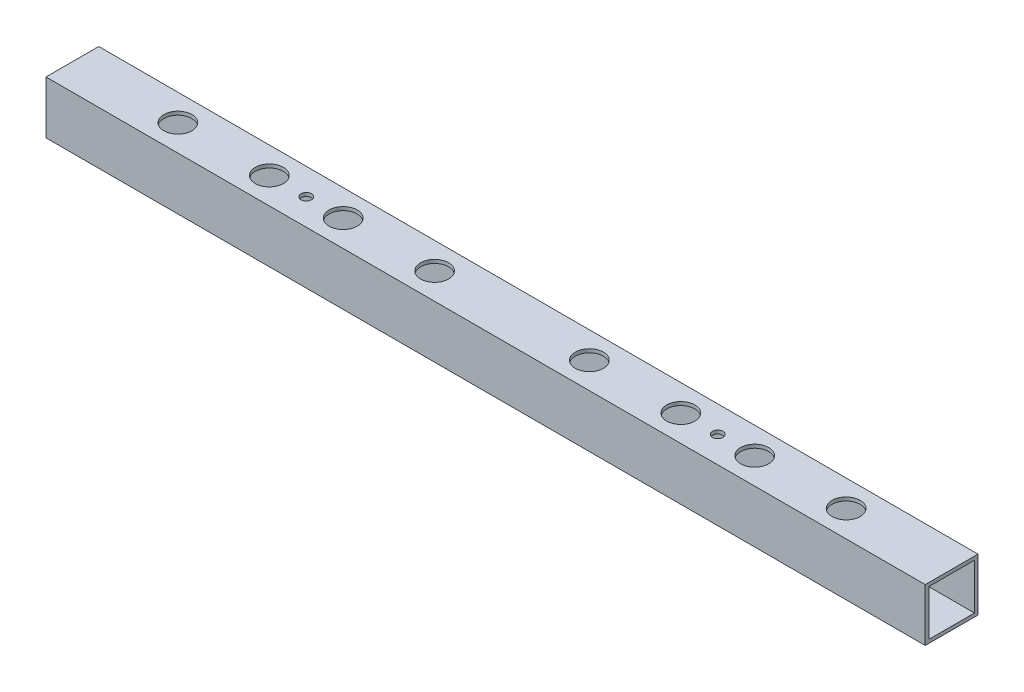
ISO-10303-21;
HEADER;
FILE_DESCRIPTION(('STEP AP214'),'2;1');
FILE_NAME('part.step','',(''),(''),'','','');
FILE_SCHEMA(('AUTOMOTIVE_DESIGN { 1 0 10303 214 1 1 1 1 }'));
ENDSEC;
DATA;
#1=APPLICATION_CONTEXT('core data for automotive mechanical design processes');
#2=APPLICATION_PROTOCOL_DEFINITION('international standard','automotive_design',2000,#1);
#3=PRODUCT_CONTEXT('',#1,'mechanical');
#4=PRODUCT('Part','Part','',(#3));
#5=PRODUCT_RELATED_PRODUCT_CATEGORY('part','',(#4));
#6=PRODUCT_DEFINITION_FORMATION('','',#4);
#7=PRODUCT_DEFINITION_CONTEXT('part definition',#1,'design');
#8=PRODUCT_DEFINITION('design','',#6,#7);
#9=PRODUCT_DEFINITION_SHAPE('','',#8);
#10=(LENGTH_UNIT() NAMED_UNIT(*) SI_UNIT(.MILLI.,.METRE.));
#11=(NAMED_UNIT(*) PLANE_ANGLE_UNIT() SI_UNIT($,.RADIAN.));
#12=(NAMED_UNIT(*) SI_UNIT($,.STERADIAN.) SOLID_ANGLE_UNIT());
#13=UNCERTAINTY_MEASURE_WITH_UNIT(LENGTH_MEASURE(1.E-05),#10,'distance_accuracy_value','');
#14=(GEOMETRIC_REPRESENTATION_CONTEXT(3) GLOBAL_UNCERTAINTY_ASSIGNED_CONTEXT((#13)) GLOBAL_UNIT_ASSIGNED_CONTEXT((#10,
#11,#12)) REPRESENTATION_CONTEXT('',''));
#15=CARTESIAN_POINT('',(0.,0.,0.));
#16=DIRECTION('',(0.,0.,1.));
#17=DIRECTION('',(1.,0.,0.));
#18=AXIS2_PLACEMENT_3D('',#15,#16,#17);
#19=CARTESIAN_POINT('',(250.,0.,0.));
#20=DIRECTION('',(-1.,0.,0.));
#21=DIRECTION('',(0.,0.,1.));
#22=AXIS2_PLACEMENT_3D('',#19,#20,#21);
#23=PLANE('',#22);
#24=DIRECTION('',(0.,1.,0.));
#25=VECTOR('',#24,1.);
#26=CARTESIAN_POINT('',(250.,-7.5,-7.5));
#27=LINE('',#26,#25);
#28=CARTESIAN_POINT('',(250.,-7.5,-7.5));
#29=VERTEX_POINT('',#28);
#30=CARTESIAN_POINT('',(250.,7.5,-7.5));
#31=VERTEX_POINT('',#30);
#32=EDGE_CURVE('E140',#29,#31,#27,.T.);
#33=ORIENTED_EDGE('',*,*,#32,.T.);
#34=DIRECTION('',(0.,0.,1.));
#35=VECTOR('',#34,1.);
#36=CARTESIAN_POINT('',(250.,7.5,7.5));
#37=LINE('',#36,#35);
#38=CARTESIAN_POINT('',(250.,7.5,7.5));
#39=VERTEX_POINT('',#38);
#40=EDGE_CURVE('E143',#31,#39,#37,.T.);
#41=ORIENTED_EDGE('',*,*,#40,.T.);
#42=DIRECTION('',(0.,-1.,0.));
#43=VECTOR('',#42,1.);
#44=CARTESIAN_POINT('',(250.,-7.5,7.5));
#45=LINE('',#44,#43);
#46=CARTESIAN_POINT('',(250.,-7.5,7.5));
#47=VERTEX_POINT('',#46);
#48=EDGE_CURVE('E146',#39,#47,#45,.T.);
#49=ORIENTED_EDGE('',*,*,#48,.T.);
#50=DIRECTION('',(0.,0.,-1.));
#51=VECTOR('',#50,1.);
#52=CARTESIAN_POINT('',(250.,-7.5,7.5));
#53=LINE('',#52,#51);
#54=EDGE_CURVE('E148',#47,#29,#53,.T.);
#55=ORIENTED_EDGE('',*,*,#54,.T.);
#56=EDGE_LOOP('',(#33,#41,#49,#55));
#57=FACE_BOUND('',#56,.T.);
#58=DIRECTION('',(0.,-1.,0.));
#59=VECTOR('',#58,1.);
#60=CARTESIAN_POINT('',(250.,-6.5,6.5));
#61=LINE('',#60,#59);
#62=CARTESIAN_POINT('',(250.,6.5,6.5));
#63=VERTEX_POINT('',#62);
#64=CARTESIAN_POINT('',(250.,-6.5,6.5));
#65=VERTEX_POINT('',#64);
#66=EDGE_CURVE('E102',#63,#65,#61,.T.);
#67=ORIENTED_EDGE('',*,*,#66,.F.);
#68=DIRECTION('',(0.,0.,1.));
#69=VECTOR('',#68,1.);
#70=CARTESIAN_POINT('',(250.,6.5,6.5));
#71=LINE('',#70,#69);
#72=CARTESIAN_POINT('',(250.,6.5,-6.5));
#73=VERTEX_POINT('',#72);
#74=EDGE_CURVE('E124',#73,#63,#71,.T.);
#75=ORIENTED_EDGE('',*,*,#74,.F.);
#76=DIRECTION('',(0.,1.,0.));
#77=VECTOR('',#76,1.);
#78=CARTESIAN_POINT('',(250.,-6.5,-6.5));
#79=LINE('',#78,#77);
#80=CARTESIAN_POINT('',(250.,-6.5,-6.5));
#81=VERTEX_POINT('',#80);
#82=EDGE_CURVE('E122',#81,#73,#79,.T.);
#83=ORIENTED_EDGE('',*,*,#82,.F.);
#84=DIRECTION('',(0.,0.,-1.));
#85=VECTOR('',#84,1.);
#86=CARTESIAN_POINT('',(250.,-6.5,6.5));
#87=LINE('',#86,#85);
#88=EDGE_CURVE('E110',#65,#81,#87,.T.);
#89=ORIENTED_EDGE('',*,*,#88,.F.);
#90=EDGE_LOOP('',(#67,#75,#83,#89));
#91=FACE_BOUND('',#90,.T.);
#92=ADVANCED_FACE('F35',(#57,#91),#23,.F.);
#93=CARTESIAN_POINT('',(0.,0.,0.));
#94=DIRECTION('',(-1.,0.,0.));
#95=DIRECTION('',(0.,0.,1.));
#96=AXIS2_PLACEMENT_3D('',#93,#94,#95);
#97=PLANE('',#96);
#98=DIRECTION('',(0.,1.,0.));
#99=VECTOR('',#98,1.);
#100=CARTESIAN_POINT('',(0.,-7.5,-7.5));
#101=LINE('',#100,#99);
#102=CARTESIAN_POINT('',(0.,-7.5,-7.5));
#103=VERTEX_POINT('',#102);
#104=CARTESIAN_POINT('',(0.,7.5,-7.5));
#105=VERTEX_POINT('',#104);
#106=EDGE_CURVE('E118',#103,#105,#101,.T.);
#107=ORIENTED_EDGE('',*,*,#106,.F.);
#108=DIRECTION('',(0.,0.,-1.));
#109=VECTOR('',#108,1.);
#110=CARTESIAN_POINT('',(0.,-7.5,7.5));
#111=LINE('',#110,#109);
#112=CARTESIAN_POINT('',(0.,-7.5,7.5));
#113=VERTEX_POINT('',#112);
#114=EDGE_CURVE('E144',#113,#103,#111,.T.);
#115=ORIENTED_EDGE('',*,*,#114,.F.);
#116=DIRECTION('',(0.,-1.,0.));
#117=VECTOR('',#116,1.);
#118=CARTESIAN_POINT('',(0.,-7.5,7.5));
#119=LINE('',#118,#117);
#120=CARTESIAN_POINT('',(0.,7.5,7.5));
#121=VERTEX_POINT('',#120);
#122=EDGE_CURVE('E155',#121,#113,#119,.T.);
#123=ORIENTED_EDGE('',*,*,#122,.F.);
#124=DIRECTION('',(0.,0.,1.));
#125=VECTOR('',#124,1.);
#126=CARTESIAN_POINT('',(0.,7.5,7.5));
#127=LINE('',#126,#125);
#128=EDGE_CURVE('E153',#105,#121,#127,.T.);
#129=ORIENTED_EDGE('',*,*,#128,.F.);
#130=EDGE_LOOP('',(#107,#115,#123,#129));
#131=FACE_BOUND('',#130,.T.);
#132=DIRECTION('',(0.,0.,1.));
#133=VECTOR('',#132,1.);
#134=CARTESIAN_POINT('',(0.,6.5,6.5));
#135=LINE('',#134,#133);
#136=CARTESIAN_POINT('',(0.,6.5,-6.5));
#137=VERTEX_POINT('',#136);
#138=CARTESIAN_POINT('',(0.,6.5,6.5));
#139=VERTEX_POINT('',#138);
#140=EDGE_CURVE('E111',#137,#139,#135,.T.);
#141=ORIENTED_EDGE('',*,*,#140,.T.);
#142=DIRECTION('',(0.,-1.,0.));
#143=VECTOR('',#142,1.);
#144=CARTESIAN_POINT('',(0.,-6.5,6.5));
#145=LINE('',#144,#143);
#146=CARTESIAN_POINT('',(0.,-6.5,6.5));
#147=VERTEX_POINT('',#146);
#148=EDGE_CURVE('E60',#139,#147,#145,.T.);
#149=ORIENTED_EDGE('',*,*,#148,.T.);
#150=DIRECTION('',(0.,0.,-1.));
#151=VECTOR('',#150,1.);
#152=CARTESIAN_POINT('',(0.,-6.5,6.5));
#153=LINE('',#152,#151);
#154=CARTESIAN_POINT('',(0.,-6.5,-6.5));
#155=VERTEX_POINT('',#154);
#156=EDGE_CURVE('E117',#147,#155,#153,.T.);
#157=ORIENTED_EDGE('',*,*,#156,.T.);
#158=DIRECTION('',(0.,1.,0.));
#159=VECTOR('',#158,1.);
#160=CARTESIAN_POINT('',(0.,-6.5,-6.5));
#161=LINE('',#160,#159);
#162=EDGE_CURVE('E132',#155,#137,#161,.T.);
#163=ORIENTED_EDGE('',*,*,#162,.T.);
#164=EDGE_LOOP('',(#141,#149,#157,#163));
#165=FACE_BOUND('',#164,.T.);
#166=ADVANCED_FACE('F305',(#131,#165),#97,.T.);
#167=CARTESIAN_POINT('',(250.,-7.5,-7.5));
#168=DIRECTION('',(0.,0.,1.));
#169=DIRECTION('',(1.,0.,0.));
#170=AXIS2_PLACEMENT_3D('',#167,#168,#169);
#171=PLANE('',#170);
#172=ORIENTED_EDGE('',*,*,#106,.T.);
#173=DIRECTION('',(-1.,0.,0.));
#174=VECTOR('',#173,1.);
#175=CARTESIAN_POINT('',(250.,7.5,-7.5));
#176=LINE('',#175,#174);
#177=EDGE_CURVE('E11',#31,#105,#176,.T.);
#178=ORIENTED_EDGE('',*,*,#177,.F.);
#179=ORIENTED_EDGE('',*,*,#32,.F.);
#180=DIRECTION('',(-1.,0.,0.));
#181=VECTOR('',#180,1.);
#182=CARTESIAN_POINT('',(250.,-7.5,-7.5));
#183=LINE('',#182,#181);
#184=EDGE_CURVE('E150',#29,#103,#183,.T.);
#185=ORIENTED_EDGE('',*,*,#184,.T.);
#186=EDGE_LOOP('',(#172,#178,#179,#185));
#187=FACE_BOUND('',#186,.T.);
#188=ADVANCED_FACE('F37',(#187),#171,.F.);
#189=CARTESIAN_POINT('',(250.,7.5,7.5));
#190=DIRECTION('',(0.,-1.,0.));
#191=DIRECTION('',(0.,0.,-1.));
#192=AXIS2_PLACEMENT_3D('',#189,#190,#191);
#193=PLANE('',#192);
#194=CARTESIAN_POINT('',(220.,7.5,0.));
#195=DIRECTION('',(0.,1.,0.));
#196=DIRECTION('',(0.,0.,-1.));
#197=AXIS2_PLACEMENT_3D('',#194,#195,#196);
#198=CIRCLE('',#197,4.00000000000002);
#199=CARTESIAN_POINT('',(220.,7.5,-4.00000000000002));
#200=VERTEX_POINT('',#199);
#201=EDGE_CURVE('E203',#200,#200,#198,.T.);
#202=ORIENTED_EDGE('',*,*,#201,.F.);
#203=EDGE_LOOP('',(#202));
#204=FACE_BOUND('',#203,.T.);
#205=CARTESIAN_POINT('',(194.,7.5,0.));
#206=DIRECTION('',(0.,1.,0.));
#207=DIRECTION('',(0.,0.,-1.));
#208=AXIS2_PLACEMENT_3D('',#205,#206,#207);
#209=CIRCLE('',#208,3.99999999999999);
#210=CARTESIAN_POINT('',(194.,7.5,-3.99999999999999));
#211=VERTEX_POINT('',#210);
#212=EDGE_CURVE('E208',#211,#211,#209,.T.);
#213=ORIENTED_EDGE('',*,*,#212,.F.);
#214=EDGE_LOOP('',(#213));
#215=FACE_BOUND('',#214,.T.);
#216=CARTESIAN_POINT('',(147.,7.5,0.));
#217=DIRECTION('',(0.,1.,0.));
#218=DIRECTION('',(0.,0.,-1.));
#219=AXIS2_PLACEMENT_3D('',#216,#217,#218);
#220=CIRCLE('',#219,3.99999999999999);
#221=CARTESIAN_POINT('',(147.,7.5,-3.99999999999999));
#222=VERTEX_POINT('',#221);
#223=EDGE_CURVE('E222',#222,#222,#220,.T.);
#224=ORIENTED_EDGE('',*,*,#223,.F.);
#225=EDGE_LOOP('',(#224));
#226=FACE_BOUND('',#225,.T.);
#227=CARTESIAN_POINT('',(77.,7.5,0.));
#228=DIRECTION('',(0.,1.,0.));
#229=DIRECTION('',(0.,0.,1.));
#230=AXIS2_PLACEMENT_3D('',#227,#228,#229);
#231=CIRCLE('',#230,4.00000000000001);
#232=CARTESIAN_POINT('',(77.,7.5,4.00000000000001));
#233=VERTEX_POINT('',#232);
#234=EDGE_CURVE('E218',#233,#233,#231,.T.);
#235=ORIENTED_EDGE('',*,*,#234,.F.);
#236=EDGE_LOOP('',(#235));
#237=FACE_BOUND('',#236,.T.);
#238=CARTESIAN_POINT('',(173.,7.5,0.));
#239=DIRECTION('',(0.,1.,0.));
#240=DIRECTION('',(0.,0.,1.));
#241=AXIS2_PLACEMENT_3D('',#238,#239,#240);
#242=CIRCLE('',#241,3.99999999999999);
#243=CARTESIAN_POINT('',(173.,7.5,3.99999999999999));
#244=VERTEX_POINT('',#243);
#245=EDGE_CURVE('E221',#244,#244,#242,.T.);
#246=ORIENTED_EDGE('',*,*,#245,.F.);
#247=EDGE_LOOP('',(#246));
#248=FACE_BOUND('',#247,.T.);
#249=CARTESIAN_POINT('',(103.,7.5,0.));
#250=DIRECTION('',(0.,1.,0.));
#251=DIRECTION('',(0.,0.,1.));
#252=AXIS2_PLACEMENT_3D('',#249,#250,#251);
#253=CIRCLE('',#252,4.00000000000001);
#254=CARTESIAN_POINT('',(103.,7.5,4.00000000000001));
#255=VERTEX_POINT('',#254);
#256=EDGE_CURVE('E229',#255,#255,#253,.T.);
#257=ORIENTED_EDGE('',*,*,#256,.F.);
#258=EDGE_LOOP('',(#257));
#259=FACE_BOUND('',#258,.T.);
#260=CARTESIAN_POINT('',(56.,7.5,0.));
#261=DIRECTION('',(0.,1.,0.));
#262=DIRECTION('',(0.,0.,1.));
#263=AXIS2_PLACEMENT_3D('',#260,#261,#262);
#264=CIRCLE('',#263,4.);
#265=CARTESIAN_POINT('',(56.,7.5,4.));
#266=VERTEX_POINT('',#265);
#267=EDGE_CURVE('E184',#266,#266,#264,.T.);
#268=ORIENTED_EDGE('',*,*,#267,.F.);
#269=EDGE_LOOP('',(#268));
#270=FACE_BOUND('',#269,.T.);
#271=CARTESIAN_POINT('',(30.,7.5,0.));
#272=DIRECTION('',(0.,1.,0.));
#273=DIRECTION('',(0.,0.,1.));
#274=AXIS2_PLACEMENT_3D('',#271,#272,#273);
#275=CIRCLE('',#274,4.);
#276=CARTESIAN_POINT('',(30.,7.5,4.));
#277=VERTEX_POINT('',#276);
#278=EDGE_CURVE('E179',#277,#277,#275,.T.);
#279=ORIENTED_EDGE('',*,*,#278,.F.);
#280=EDGE_LOOP('',(#279));
#281=FACE_BOUND('',#280,.T.);
#282=CARTESIAN_POINT('',(66.5,7.5,0.));
#283=DIRECTION('',(0.,1.,0.));
#284=DIRECTION('',(0.,0.,1.));
#285=AXIS2_PLACEMENT_3D('',#282,#283,#284);
#286=CIRCLE('',#285,1.5);
#287=CARTESIAN_POINT('',(66.5,7.5,1.5));
#288=VERTEX_POINT('',#287);
#289=EDGE_CURVE('E236',#288,#288,#286,.T.);
#290=ORIENTED_EDGE('',*,*,#289,.F.);
#291=EDGE_LOOP('',(#290));
#292=FACE_BOUND('',#291,.T.);
#293=CARTESIAN_POINT('',(183.5,7.5,0.));
#294=DIRECTION('',(0.,1.,0.));
#295=DIRECTION('',(0.,0.,-1.));
#296=AXIS2_PLACEMENT_3D('',#293,#294,#295);
#297=CIRCLE('',#296,1.5);
#298=CARTESIAN_POINT('',(183.5,7.5,-1.5));
#299=VERTEX_POINT('',#298);
#300=EDGE_CURVE('E178',#299,#299,#297,.T.);
#301=ORIENTED_EDGE('',*,*,#300,.F.);
#302=EDGE_LOOP('',(#301));
#303=FACE_BOUND('',#302,.T.);
#304=ORIENTED_EDGE('',*,*,#128,.T.);
#305=DIRECTION('',(-1.,0.,0.));
#306=VECTOR('',#305,1.);
#307=CARTESIAN_POINT('',(250.,7.5,7.5));
#308=LINE('',#307,#306);
#309=EDGE_CURVE('E44',#39,#121,#308,.T.);
#310=ORIENTED_EDGE('',*,*,#309,.F.);
#311=ORIENTED_EDGE('',*,*,#40,.F.);
#312=ORIENTED_EDGE('',*,*,#177,.T.);
#313=EDGE_LOOP('',(#304,#310,#311,#312));
#314=FACE_BOUND('',#313,.T.);
#315=ADVANCED_FACE('F321',(#204,#215,#226,#237,#248,#259,#270,#281,#292,#303,#314),#193,.F.);
#316=CARTESIAN_POINT('',(250.,-7.5,7.5));
#317=DIRECTION('',(0.,0.,-1.));
#318=DIRECTION('',(-1.,0.,0.));
#319=AXIS2_PLACEMENT_3D('',#316,#317,#318);
#320=PLANE('',#319);
#321=ORIENTED_EDGE('',*,*,#122,.T.);
#322=DIRECTION('',(-1.,0.,0.));
#323=VECTOR('',#322,1.);
#324=CARTESIAN_POINT('',(250.,-7.5,7.5));
#325=LINE('',#324,#323);
#326=EDGE_CURVE('E160',#47,#113,#325,.T.);
#327=ORIENTED_EDGE('',*,*,#326,.F.);
#328=ORIENTED_EDGE('',*,*,#48,.F.);
#329=ORIENTED_EDGE('',*,*,#309,.T.);
#330=EDGE_LOOP('',(#321,#327,#328,#329));
#331=FACE_BOUND('',#330,.T.);
#332=ADVANCED_FACE('F318',(#331),#320,.F.);
#333=CARTESIAN_POINT('',(250.,-7.5,7.5));
#334=DIRECTION('',(0.,1.,0.));
#335=DIRECTION('',(0.,0.,1.));
#336=AXIS2_PLACEMENT_3D('',#333,#334,#335);
#337=PLANE('',#336);
#338=CARTESIAN_POINT('',(183.5,-7.5,0.));
#339=DIRECTION('',(0.,-1.,0.));
#340=DIRECTION('',(0.,0.,-1.));
#341=AXIS2_PLACEMENT_3D('',#338,#339,#340);
#342=CIRCLE('',#341,3.99999999999999);
#343=CARTESIAN_POINT('',(183.5,-7.5,-3.99999999999999));
#344=VERTEX_POINT('',#343);
#345=EDGE_CURVE('E215',#344,#344,#342,.T.);
#346=ORIENTED_EDGE('',*,*,#345,.F.);
#347=EDGE_LOOP('',(#346));
#348=FACE_BOUND('',#347,.T.);
#349=CARTESIAN_POINT('',(66.5,-7.5,0.));
#350=DIRECTION('',(0.,-1.,0.));
#351=DIRECTION('',(0.,0.,-1.));
#352=AXIS2_PLACEMENT_3D('',#349,#350,#351);
#353=CIRCLE('',#352,4.00000000000001);
#354=CARTESIAN_POINT('',(66.5,-7.5,-4.00000000000001));
#355=VERTEX_POINT('',#354);
#356=EDGE_CURVE('E204',#355,#355,#353,.T.);
#357=ORIENTED_EDGE('',*,*,#356,.F.);
#358=EDGE_LOOP('',(#357));
#359=FACE_BOUND('',#358,.T.);
#360=CARTESIAN_POINT('',(56.,-7.50000000000001,0.));
#361=DIRECTION('',(0.,1.,0.));
#362=DIRECTION('',(0.,0.,1.));
#363=AXIS2_PLACEMENT_3D('',#360,#361,#362);
#364=CIRCLE('',#363,1.5);
#365=CARTESIAN_POINT('',(56.,-7.50000000000001,1.5));
#366=VERTEX_POINT('',#365);
#367=EDGE_CURVE('E276',#366,#366,#364,.T.);
#368=ORIENTED_EDGE('',*,*,#367,.T.);
#369=EDGE_LOOP('',(#368));
#370=FACE_BOUND('',#369,.T.);
#371=CARTESIAN_POINT('',(103.,-7.50000000000001,0.));
#372=DIRECTION('',(0.,1.,0.));
#373=DIRECTION('',(0.,0.,1.));
#374=AXIS2_PLACEMENT_3D('',#371,#372,#373);
#375=CIRCLE('',#374,1.5);
#376=CARTESIAN_POINT('',(103.,-7.50000000000001,1.5));
#377=VERTEX_POINT('',#376);
#378=EDGE_CURVE('E174',#377,#377,#375,.T.);
#379=ORIENTED_EDGE('',*,*,#378,.T.);
#380=EDGE_LOOP('',(#379));
#381=FACE_BOUND('',#380,.T.);
#382=CARTESIAN_POINT('',(77.,-7.50000000000001,0.));
#383=DIRECTION('',(0.,1.,0.));
#384=DIRECTION('',(0.,0.,1.));
#385=AXIS2_PLACEMENT_3D('',#382,#383,#384);
#386=CIRCLE('',#385,1.5);
#387=CARTESIAN_POINT('',(77.,-7.50000000000001,1.5));
#388=VERTEX_POINT('',#387);
#389=EDGE_CURVE('E266',#388,#388,#386,.T.);
#390=ORIENTED_EDGE('',*,*,#389,.T.);
#391=EDGE_LOOP('',(#390));
#392=FACE_BOUND('',#391,.T.);
#393=CARTESIAN_POINT('',(173.,-7.50000000000001,0.));
#394=DIRECTION('',(0.,1.,0.));
#395=DIRECTION('',(0.,0.,1.));
#396=AXIS2_PLACEMENT_3D('',#393,#394,#395);
#397=CIRCLE('',#396,1.5);
#398=CARTESIAN_POINT('',(173.,-7.50000000000001,1.5));
#399=VERTEX_POINT('',#398);
#400=EDGE_CURVE('E260',#399,#399,#397,.T.);
#401=ORIENTED_EDGE('',*,*,#400,.T.);
#402=EDGE_LOOP('',(#401));
#403=FACE_BOUND('',#402,.T.);
#404=CARTESIAN_POINT('',(147.,-7.50000000000001,0.));
#405=DIRECTION('',(0.,1.,0.));
#406=DIRECTION('',(0.,0.,1.));
#407=AXIS2_PLACEMENT_3D('',#404,#405,#406);
#408=CIRCLE('',#407,1.49999999999997);
#409=CARTESIAN_POINT('',(147.,-7.50000000000001,1.49999999999997));
#410=VERTEX_POINT('',#409);
#411=EDGE_CURVE('E254',#410,#410,#408,.T.);
#412=ORIENTED_EDGE('',*,*,#411,.T.);
#413=EDGE_LOOP('',(#412));
#414=FACE_BOUND('',#413,.T.);
#415=CARTESIAN_POINT('',(194.,-7.50000000000001,0.));
#416=DIRECTION('',(0.,1.,0.));
#417=DIRECTION('',(0.,0.,1.));
#418=AXIS2_PLACEMENT_3D('',#415,#416,#417);
#419=CIRCLE('',#418,1.50000000000003);
#420=CARTESIAN_POINT('',(194.,-7.50000000000001,1.50000000000003));
#421=VERTEX_POINT('',#420);
#422=EDGE_CURVE('E169',#421,#421,#419,.T.);
#423=ORIENTED_EDGE('',*,*,#422,.T.);
#424=EDGE_LOOP('',(#423));
#425=FACE_BOUND('',#424,.T.);
#426=CARTESIAN_POINT('',(220.,-7.50000000000001,0.));
#427=DIRECTION('',(0.,1.,0.));
#428=DIRECTION('',(0.,0.,1.));
#429=AXIS2_PLACEMENT_3D('',#426,#427,#428);
#430=CIRCLE('',#429,1.50000000000003);
#431=CARTESIAN_POINT('',(220.,-7.50000000000001,1.50000000000003));
#432=VERTEX_POINT('',#431);
#433=EDGE_CURVE('E244',#432,#432,#430,.T.);
#434=ORIENTED_EDGE('',*,*,#433,.T.);
#435=EDGE_LOOP('',(#434));
#436=FACE_BOUND('',#435,.T.);
#437=CARTESIAN_POINT('',(30.,-7.50000000000001,0.));
#438=DIRECTION('',(0.,1.,0.));
#439=DIRECTION('',(0.,0.,1.));
#440=AXIS2_PLACEMENT_3D('',#437,#438,#439);
#441=CIRCLE('',#440,1.5);
#442=CARTESIAN_POINT('',(30.,-7.50000000000001,1.5));
#443=VERTEX_POINT('',#442);
#444=EDGE_CURVE('E130',#443,#443,#441,.T.);
#445=ORIENTED_EDGE('',*,*,#444,.T.);
#446=EDGE_LOOP('',(#445));
#447=FACE_BOUND('',#446,.T.);
#448=ORIENTED_EDGE('',*,*,#114,.T.);
#449=ORIENTED_EDGE('',*,*,#184,.F.);
#450=ORIENTED_EDGE('',*,*,#54,.F.);
#451=ORIENTED_EDGE('',*,*,#326,.T.);
#452=EDGE_LOOP('',(#448,#449,#450,#451));
#453=FACE_BOUND('',#452,.T.);
#454=ADVANCED_FACE('F284',(#348,#359,#370,#381,#392,#403,#414,#425,#436,#447,#453),#337,.F.);
#455=CARTESIAN_POINT('',(250.,-6.5,6.5));
#456=DIRECTION('',(0.,0.,-1.));
#457=DIRECTION('',(-1.,0.,0.));
#458=AXIS2_PLACEMENT_3D('',#455,#456,#457);
#459=PLANE('',#458);
#460=ORIENTED_EDGE('',*,*,#148,.F.);
#461=DIRECTION('',(-1.,0.,0.));
#462=VECTOR('',#461,1.);
#463=CARTESIAN_POINT('',(250.,6.5,6.5));
#464=LINE('',#463,#462);
#465=EDGE_CURVE('E106',#63,#139,#464,.T.);
#466=ORIENTED_EDGE('',*,*,#465,.F.);
#467=ORIENTED_EDGE('',*,*,#66,.T.);
#468=DIRECTION('',(-1.,0.,0.));
#469=VECTOR('',#468,1.);
#470=CARTESIAN_POINT('',(250.,-6.5,6.5));
#471=LINE('',#470,#469);
#472=EDGE_CURVE('E105',#65,#147,#471,.T.);
#473=ORIENTED_EDGE('',*,*,#472,.T.);
#474=EDGE_LOOP('',(#460,#466,#467,#473));
#475=FACE_BOUND('',#474,.T.);
#476=ADVANCED_FACE('F104',(#475),#459,.T.);
#477=CARTESIAN_POINT('',(250.,-6.5,6.5));
#478=DIRECTION('',(0.,1.,0.));
#479=DIRECTION('',(0.,0.,1.));
#480=AXIS2_PLACEMENT_3D('',#477,#478,#479);
#481=PLANE('',#480);
#482=CARTESIAN_POINT('',(183.5,-6.5,0.));
#483=DIRECTION('',(0.,1.,0.));
#484=DIRECTION('',(0.,0.,1.));
#485=AXIS2_PLACEMENT_3D('',#482,#483,#484);
#486=CIRCLE('',#485,3.99999999999999);
#487=CARTESIAN_POINT('',(183.5,-6.5,3.99999999999999));
#488=VERTEX_POINT('',#487);
#489=EDGE_CURVE('E39',#488,#488,#486,.T.);
#490=ORIENTED_EDGE('',*,*,#489,.F.);
#491=EDGE_LOOP('',(#490));
#492=FACE_BOUND('',#491,.T.);
#493=CARTESIAN_POINT('',(66.5,-6.5,0.));
#494=DIRECTION('',(0.,1.,0.));
#495=DIRECTION('',(0.,0.,1.));
#496=AXIS2_PLACEMENT_3D('',#493,#494,#495);
#497=CIRCLE('',#496,4.00000000000001);
#498=CARTESIAN_POINT('',(66.5,-6.5,4.00000000000001));
#499=VERTEX_POINT('',#498);
#500=EDGE_CURVE('E201',#499,#499,#497,.T.);
#501=ORIENTED_EDGE('',*,*,#500,.F.);
#502=EDGE_LOOP('',(#501));
#503=FACE_BOUND('',#502,.T.);
#504=CARTESIAN_POINT('',(56.,-6.50000000000001,0.));
#505=DIRECTION('',(0.,1.,0.));
#506=DIRECTION('',(0.,0.,1.));
#507=AXIS2_PLACEMENT_3D('',#504,#505,#506);
#508=CIRCLE('',#507,1.5);
#509=CARTESIAN_POINT('',(56.,-6.50000000000001,1.5));
#510=VERTEX_POINT('',#509);
#511=EDGE_CURVE('E173',#510,#510,#508,.T.);
#512=ORIENTED_EDGE('',*,*,#511,.F.);
#513=EDGE_LOOP('',(#512));
#514=FACE_BOUND('',#513,.T.);
#515=CARTESIAN_POINT('',(103.,-6.50000000000001,0.));
#516=DIRECTION('',(0.,1.,0.));
#517=DIRECTION('',(0.,0.,1.));
#518=AXIS2_PLACEMENT_3D('',#515,#516,#517);
#519=CIRCLE('',#518,1.5);
#520=CARTESIAN_POINT('',(103.,-6.50000000000001,1.5));
#521=VERTEX_POINT('',#520);
#522=EDGE_CURVE('E269',#521,#521,#519,.T.);
#523=ORIENTED_EDGE('',*,*,#522,.F.);
#524=EDGE_LOOP('',(#523));
#525=FACE_BOUND('',#524,.T.);
#526=CARTESIAN_POINT('',(77.,-6.50000000000001,0.));
#527=DIRECTION('',(0.,1.,0.));
#528=DIRECTION('',(0.,0.,1.));
#529=AXIS2_PLACEMENT_3D('',#526,#527,#528);
#530=CIRCLE('',#529,1.5);
#531=CARTESIAN_POINT('',(77.,-6.50000000000001,1.5));
#532=VERTEX_POINT('',#531);
#533=EDGE_CURVE('E263',#532,#532,#530,.T.);
#534=ORIENTED_EDGE('',*,*,#533,.F.);
#535=EDGE_LOOP('',(#534));
#536=FACE_BOUND('',#535,.T.);
#537=CARTESIAN_POINT('',(173.,-6.50000000000001,0.));
#538=DIRECTION('',(0.,1.,0.));
#539=DIRECTION('',(0.,0.,1.));
#540=AXIS2_PLACEMENT_3D('',#537,#538,#539);
#541=CIRCLE('',#540,1.5);
#542=CARTESIAN_POINT('',(173.,-6.50000000000001,1.5));
#543=VERTEX_POINT('',#542);
#544=EDGE_CURVE('E257',#543,#543,#541,.T.);
#545=ORIENTED_EDGE('',*,*,#544,.F.);
#546=EDGE_LOOP('',(#545));
#547=FACE_BOUND('',#546,.T.);
#548=CARTESIAN_POINT('',(147.,-6.50000000000001,0.));
#549=DIRECTION('',(0.,1.,0.));
#550=DIRECTION('',(0.,0.,1.));
#551=AXIS2_PLACEMENT_3D('',#548,#549,#550);
#552=CIRCLE('',#551,1.49999999999997);
#553=CARTESIAN_POINT('',(147.,-6.50000000000001,1.49999999999997));
#554=VERTEX_POINT('',#553);
#555=EDGE_CURVE('E168',#554,#554,#552,.T.);
#556=ORIENTED_EDGE('',*,*,#555,.F.);
#557=EDGE_LOOP('',(#556));
#558=FACE_BOUND('',#557,.T.);
#559=CARTESIAN_POINT('',(194.,-6.50000000000001,0.));
#560=DIRECTION('',(0.,1.,0.));
#561=DIRECTION('',(0.,0.,1.));
#562=AXIS2_PLACEMENT_3D('',#559,#560,#561);
#563=CIRCLE('',#562,1.50000000000003);
#564=CARTESIAN_POINT('',(194.,-6.50000000000001,1.50000000000003));
#565=VERTEX_POINT('',#564);
#566=EDGE_CURVE('E247',#565,#565,#563,.T.);
#567=ORIENTED_EDGE('',*,*,#566,.F.);
#568=EDGE_LOOP('',(#567));
#569=FACE_BOUND('',#568,.T.);
#570=CARTESIAN_POINT('',(220.,-6.50000000000001,0.));
#571=DIRECTION('',(0.,1.,0.));
#572=DIRECTION('',(0.,0.,1.));
#573=AXIS2_PLACEMENT_3D('',#570,#571,#572);
#574=CIRCLE('',#573,1.50000000000003);
#575=CARTESIAN_POINT('',(220.,-6.50000000000001,1.50000000000003));
#576=VERTEX_POINT('',#575);
#577=EDGE_CURVE('E239',#576,#576,#574,.T.);
#578=ORIENTED_EDGE('',*,*,#577,.F.);
#579=EDGE_LOOP('',(#578));
#580=FACE_BOUND('',#579,.T.);
#581=CARTESIAN_POINT('',(30.,-6.50000000000001,0.));
#582=DIRECTION('',(0.,1.,0.));
#583=DIRECTION('',(0.,0.,1.));
#584=AXIS2_PLACEMENT_3D('',#581,#582,#583);
#585=CIRCLE('',#584,1.5);
#586=CARTESIAN_POINT('',(30.,-6.50000000000001,1.5));
#587=VERTEX_POINT('',#586);
#588=EDGE_CURVE('E279',#587,#587,#585,.T.);
#589=ORIENTED_EDGE('',*,*,#588,.F.);
#590=EDGE_LOOP('',(#589));
#591=FACE_BOUND('',#590,.T.);
#592=ORIENTED_EDGE('',*,*,#156,.F.);
#593=ORIENTED_EDGE('',*,*,#472,.F.);
#594=ORIENTED_EDGE('',*,*,#88,.T.);
#595=DIRECTION('',(-1.,0.,0.));
#596=VECTOR('',#595,1.);
#597=CARTESIAN_POINT('',(250.,-6.5,-6.5));
#598=LINE('',#597,#596);
#599=EDGE_CURVE('E119',#81,#155,#598,.T.);
#600=ORIENTED_EDGE('',*,*,#599,.T.);
#601=EDGE_LOOP('',(#592,#593,#594,#600));
#602=FACE_BOUND('',#601,.T.);
#603=ADVANCED_FACE('F114',(#492,#503,#514,#525,#536,#547,#558,#569,#580,#591,#602),#481,.T.);
#604=CARTESIAN_POINT('',(250.,-6.5,-6.5));
#605=DIRECTION('',(0.,0.,1.));
#606=DIRECTION('',(0.,-1.,0.));
#607=AXIS2_PLACEMENT_3D('',#604,#605,#606);
#608=PLANE('',#607);
#609=ORIENTED_EDGE('',*,*,#162,.F.);
#610=ORIENTED_EDGE('',*,*,#599,.F.);
#611=ORIENTED_EDGE('',*,*,#82,.T.);
#612=DIRECTION('',(-1.,0.,0.));
#613=VECTOR('',#612,1.);
#614=CARTESIAN_POINT('',(250.,6.5,-6.5));
#615=LINE('',#614,#613);
#616=EDGE_CURVE('E52',#73,#137,#615,.T.);
#617=ORIENTED_EDGE('',*,*,#616,.T.);
#618=EDGE_LOOP('',(#609,#610,#611,#617));
#619=FACE_BOUND('',#618,.T.);
#620=ADVANCED_FACE('F300',(#619),#608,.T.);
#621=CARTESIAN_POINT('',(250.,6.5,6.5));
#622=DIRECTION('',(0.,-1.,0.));
#623=DIRECTION('',(0.,0.,-1.));
#624=AXIS2_PLACEMENT_3D('',#621,#622,#623);
#625=PLANE('',#624);
#626=CARTESIAN_POINT('',(220.,6.5,0.));
#627=DIRECTION('',(0.,-1.,0.));
#628=DIRECTION('',(0.,0.,-1.));
#629=AXIS2_PLACEMENT_3D('',#626,#627,#628);
#630=CIRCLE('',#629,4.00000000000002);
#631=CARTESIAN_POINT('',(220.,6.5,-4.00000000000002));
#632=VERTEX_POINT('',#631);
#633=EDGE_CURVE('E199',#632,#632,#630,.T.);
#634=ORIENTED_EDGE('',*,*,#633,.F.);
#635=EDGE_LOOP('',(#634));
#636=FACE_BOUND('',#635,.T.);
#637=CARTESIAN_POINT('',(194.,6.5,0.));
#638=DIRECTION('',(0.,-1.,0.));
#639=DIRECTION('',(0.,0.,-1.));
#640=AXIS2_PLACEMENT_3D('',#637,#638,#639);
#641=CIRCLE('',#640,3.99999999999999);
#642=CARTESIAN_POINT('',(194.,6.5,-3.99999999999999));
#643=VERTEX_POINT('',#642);
#644=EDGE_CURVE('E196',#643,#643,#641,.T.);
#645=ORIENTED_EDGE('',*,*,#644,.F.);
#646=EDGE_LOOP('',(#645));
#647=FACE_BOUND('',#646,.T.);
#648=CARTESIAN_POINT('',(147.,6.5,0.));
#649=DIRECTION('',(0.,-1.,0.));
#650=DIRECTION('',(0.,0.,-1.));
#651=AXIS2_PLACEMENT_3D('',#648,#649,#650);
#652=CIRCLE('',#651,3.99999999999999);
#653=CARTESIAN_POINT('',(147.,6.5,-3.99999999999999));
#654=VERTEX_POINT('',#653);
#655=EDGE_CURVE('E193',#654,#654,#652,.T.);
#656=ORIENTED_EDGE('',*,*,#655,.F.);
#657=EDGE_LOOP('',(#656));
#658=FACE_BOUND('',#657,.T.);
#659=CARTESIAN_POINT('',(77.,6.5,0.));
#660=DIRECTION('',(0.,-1.,0.));
#661=DIRECTION('',(0.,0.,-1.));
#662=AXIS2_PLACEMENT_3D('',#659,#660,#661);
#663=CIRCLE('',#662,4.00000000000001);
#664=CARTESIAN_POINT('',(77.,6.5,-4.00000000000001));
#665=VERTEX_POINT('',#664);
#666=EDGE_CURVE('E190',#665,#665,#663,.T.);
#667=ORIENTED_EDGE('',*,*,#666,.F.);
#668=EDGE_LOOP('',(#667));
#669=FACE_BOUND('',#668,.T.);
#670=CARTESIAN_POINT('',(173.,6.5,0.));
#671=DIRECTION('',(0.,-1.,0.));
#672=DIRECTION('',(0.,0.,-1.));
#673=AXIS2_PLACEMENT_3D('',#670,#671,#672);
#674=CIRCLE('',#673,3.99999999999999);
#675=CARTESIAN_POINT('',(173.,6.5,-3.99999999999999));
#676=VERTEX_POINT('',#675);
#677=EDGE_CURVE('E187',#676,#676,#674,.T.);
#678=ORIENTED_EDGE('',*,*,#677,.F.);
#679=EDGE_LOOP('',(#678));
#680=FACE_BOUND('',#679,.T.);
#681=CARTESIAN_POINT('',(103.,6.5,0.));
#682=DIRECTION('',(0.,-1.,0.));
#683=DIRECTION('',(0.,0.,-1.));
#684=AXIS2_PLACEMENT_3D('',#681,#682,#683);
#685=CIRCLE('',#684,4.00000000000001);
#686=CARTESIAN_POINT('',(103.,6.5,-4.00000000000001));
#687=VERTEX_POINT('',#686);
#688=EDGE_CURVE('E183',#687,#687,#685,.T.);
#689=ORIENTED_EDGE('',*,*,#688,.F.);
#690=EDGE_LOOP('',(#689));
#691=FACE_BOUND('',#690,.T.);
#692=CARTESIAN_POINT('',(56.,6.5,0.));
#693=DIRECTION('',(0.,-1.,0.));
#694=DIRECTION('',(0.,0.,-1.));
#695=AXIS2_PLACEMENT_3D('',#692,#693,#694);
#696=CIRCLE('',#695,4.);
#697=CARTESIAN_POINT('',(56.,6.5,-4.));
#698=VERTEX_POINT('',#697);
#699=EDGE_CURVE('E180',#698,#698,#696,.T.);
#700=ORIENTED_EDGE('',*,*,#699,.F.);
#701=EDGE_LOOP('',(#700));
#702=FACE_BOUND('',#701,.T.);
#703=CARTESIAN_POINT('',(30.,6.5,0.));
#704=DIRECTION('',(0.,-1.,0.));
#705=DIRECTION('',(0.,0.,-1.));
#706=AXIS2_PLACEMENT_3D('',#703,#704,#705);
#707=CIRCLE('',#706,4.);
#708=CARTESIAN_POINT('',(30.,6.5,-4.));
#709=VERTEX_POINT('',#708);
#710=EDGE_CURVE('E175',#709,#709,#707,.T.);
#711=ORIENTED_EDGE('',*,*,#710,.F.);
#712=EDGE_LOOP('',(#711));
#713=FACE_BOUND('',#712,.T.);
#714=CARTESIAN_POINT('',(66.5,6.50000000000001,0.));
#715=DIRECTION('',(0.,-1.,0.));
#716=DIRECTION('',(0.,0.,-1.));
#717=AXIS2_PLACEMENT_3D('',#714,#715,#716);
#718=CIRCLE('',#717,1.5);
#719=CARTESIAN_POINT('',(66.5,6.50000000000001,-1.5));
#720=VERTEX_POINT('',#719);
#721=EDGE_CURVE('E170',#720,#720,#718,.T.);
#722=ORIENTED_EDGE('',*,*,#721,.F.);
#723=EDGE_LOOP('',(#722));
#724=FACE_BOUND('',#723,.T.);
#725=CARTESIAN_POINT('',(183.5,6.50000000000001,0.));
#726=DIRECTION('',(0.,-1.,0.));
#727=DIRECTION('',(0.,0.,-1.));
#728=AXIS2_PLACEMENT_3D('',#725,#726,#727);
#729=CIRCLE('',#728,1.5);
#730=CARTESIAN_POINT('',(183.5,6.50000000000001,-1.5));
#731=VERTEX_POINT('',#730);
#732=EDGE_CURVE('E165',#731,#731,#729,.T.);
#733=ORIENTED_EDGE('',*,*,#732,.F.);
#734=EDGE_LOOP('',(#733));
#735=FACE_BOUND('',#734,.T.);
#736=ORIENTED_EDGE('',*,*,#140,.F.);
#737=ORIENTED_EDGE('',*,*,#616,.F.);
#738=ORIENTED_EDGE('',*,*,#74,.T.);
#739=ORIENTED_EDGE('',*,*,#465,.T.);
#740=EDGE_LOOP('',(#736,#737,#738,#739));
#741=FACE_BOUND('',#740,.T.);
#742=ADVANCED_FACE('F290',(#636,#647,#658,#669,#680,#691,#702,#713,#724,#735,#741),#625,.T.);
#743=CARTESIAN_POINT('',(30.,-242.5,0.));
#744=DIRECTION('',(0.,1.,0.));
#745=DIRECTION('',(0.,0.,1.));
#746=AXIS2_PLACEMENT_3D('',#743,#744,#745);
#747=CYLINDRICAL_SURFACE('',#746,1.5);
#748=ORIENTED_EDGE('',*,*,#588,.T.);
#749=EDGE_LOOP('',(#748));
#750=FACE_BOUND('',#749,.T.);
#751=ORIENTED_EDGE('',*,*,#444,.F.);
#752=EDGE_LOOP('',(#751));
#753=FACE_BOUND('',#752,.T.);
#754=ADVANCED_FACE('F287',(#750,#753),#747,.F.);
#755=CARTESIAN_POINT('',(183.5,-242.5,0.));
#756=DIRECTION('',(0.,1.,0.));
#757=DIRECTION('',(0.,0.,1.));
#758=AXIS2_PLACEMENT_3D('',#755,#756,#757);
#759=CYLINDRICAL_SURFACE('',#758,1.5);
#760=ORIENTED_EDGE('',*,*,#732,.T.);
#761=EDGE_LOOP('',(#760));
#762=FACE_BOUND('',#761,.T.);
#763=ORIENTED_EDGE('',*,*,#300,.T.);
#764=EDGE_LOOP('',(#763));
#765=FACE_BOUND('',#764,.T.);
#766=ADVANCED_FACE('F289',(#762,#765),#759,.F.);
#767=CARTESIAN_POINT('',(66.5,-242.5,0.));
#768=DIRECTION('',(0.,1.,0.));
#769=DIRECTION('',(0.,0.,1.));
#770=AXIS2_PLACEMENT_3D('',#767,#768,#769);
#771=CYLINDRICAL_SURFACE('',#770,1.5);
#772=ORIENTED_EDGE('',*,*,#721,.T.);
#773=EDGE_LOOP('',(#772));
#774=FACE_BOUND('',#773,.T.);
#775=ORIENTED_EDGE('',*,*,#289,.T.);
#776=EDGE_LOOP('',(#775));
#777=FACE_BOUND('',#776,.T.);
#778=ADVANCED_FACE('F297',(#774,#777),#771,.F.);
#779=CARTESIAN_POINT('',(220.,-242.5,0.));
#780=DIRECTION('',(0.,1.,0.));
#781=DIRECTION('',(0.,0.,1.));
#782=AXIS2_PLACEMENT_3D('',#779,#780,#781);
#783=CYLINDRICAL_SURFACE('',#782,1.50000000000003);
#784=ORIENTED_EDGE('',*,*,#577,.T.);
#785=EDGE_LOOP('',(#784));
#786=FACE_BOUND('',#785,.T.);
#787=ORIENTED_EDGE('',*,*,#433,.F.);
#788=EDGE_LOOP('',(#787));
#789=FACE_BOUND('',#788,.T.);
#790=ADVANCED_FACE('F390',(#786,#789),#783,.F.);
#791=CARTESIAN_POINT('',(194.,-242.5,0.));
#792=DIRECTION('',(0.,1.,0.));
#793=DIRECTION('',(0.,0.,1.));
#794=AXIS2_PLACEMENT_3D('',#791,#792,#793);
#795=CYLINDRICAL_SURFACE('',#794,1.50000000000003);
#796=ORIENTED_EDGE('',*,*,#566,.T.);
#797=EDGE_LOOP('',(#796));
#798=FACE_BOUND('',#797,.T.);
#799=ORIENTED_EDGE('',*,*,#422,.F.);
#800=EDGE_LOOP('',(#799));
#801=FACE_BOUND('',#800,.T.);
#802=ADVANCED_FACE('F393',(#798,#801),#795,.F.);
#803=CARTESIAN_POINT('',(147.,-242.5,0.));
#804=DIRECTION('',(0.,1.,0.));
#805=DIRECTION('',(0.,0.,1.));
#806=AXIS2_PLACEMENT_3D('',#803,#804,#805);
#807=CYLINDRICAL_SURFACE('',#806,1.49999999999997);
#808=ORIENTED_EDGE('',*,*,#555,.T.);
#809=EDGE_LOOP('',(#808));
#810=FACE_BOUND('',#809,.T.);
#811=ORIENTED_EDGE('',*,*,#411,.F.);
#812=EDGE_LOOP('',(#811));
#813=FACE_BOUND('',#812,.T.);
#814=ADVANCED_FACE('F400',(#810,#813),#807,.F.);
#815=CARTESIAN_POINT('',(173.,-242.5,0.));
#816=DIRECTION('',(0.,1.,0.));
#817=DIRECTION('',(0.,0.,1.));
#818=AXIS2_PLACEMENT_3D('',#815,#816,#817);
#819=CYLINDRICAL_SURFACE('',#818,1.5);
#820=ORIENTED_EDGE('',*,*,#544,.T.);
#821=EDGE_LOOP('',(#820));
#822=FACE_BOUND('',#821,.T.);
#823=ORIENTED_EDGE('',*,*,#400,.F.);
#824=EDGE_LOOP('',(#823));
#825=FACE_BOUND('',#824,.T.);
#826=ADVANCED_FACE('F408',(#822,#825),#819,.F.);
#827=CARTESIAN_POINT('',(77.,-242.5,0.));
#828=DIRECTION('',(0.,1.,0.));
#829=DIRECTION('',(0.,0.,1.));
#830=AXIS2_PLACEMENT_3D('',#827,#828,#829);
#831=CYLINDRICAL_SURFACE('',#830,1.5);
#832=ORIENTED_EDGE('',*,*,#533,.T.);
#833=EDGE_LOOP('',(#832));
#834=FACE_BOUND('',#833,.T.);
#835=ORIENTED_EDGE('',*,*,#389,.F.);
#836=EDGE_LOOP('',(#835));
#837=FACE_BOUND('',#836,.T.);
#838=ADVANCED_FACE('F412',(#834,#837),#831,.F.);
#839=CARTESIAN_POINT('',(103.,-242.5,0.));
#840=DIRECTION('',(0.,1.,0.));
#841=DIRECTION('',(0.,0.,1.));
#842=AXIS2_PLACEMENT_3D('',#839,#840,#841);
#843=CYLINDRICAL_SURFACE('',#842,1.5);
#844=ORIENTED_EDGE('',*,*,#522,.T.);
#845=EDGE_LOOP('',(#844));
#846=FACE_BOUND('',#845,.T.);
#847=ORIENTED_EDGE('',*,*,#378,.F.);
#848=EDGE_LOOP('',(#847));
#849=FACE_BOUND('',#848,.T.);
#850=ADVANCED_FACE('F416',(#846,#849),#843,.F.);
#851=CARTESIAN_POINT('',(56.,-242.5,0.));
#852=DIRECTION('',(0.,1.,0.));
#853=DIRECTION('',(0.,0.,1.));
#854=AXIS2_PLACEMENT_3D('',#851,#852,#853);
#855=CYLINDRICAL_SURFACE('',#854,1.5);
#856=ORIENTED_EDGE('',*,*,#511,.T.);
#857=EDGE_LOOP('',(#856));
#858=FACE_BOUND('',#857,.T.);
#859=ORIENTED_EDGE('',*,*,#367,.F.);
#860=EDGE_LOOP('',(#859));
#861=FACE_BOUND('',#860,.T.);
#862=ADVANCED_FACE('F419',(#858,#861),#855,.F.);
#863=CARTESIAN_POINT('',(30.,-2.5,0.));
#864=DIRECTION('',(0.,1.,0.));
#865=DIRECTION('',(0.,0.,1.));
#866=AXIS2_PLACEMENT_3D('',#863,#864,#865);
#867=CYLINDRICAL_SURFACE('',#866,4.);
#868=ORIENTED_EDGE('',*,*,#710,.T.);
#869=EDGE_LOOP('',(#868));
#870=FACE_BOUND('',#869,.T.);
#871=ORIENTED_EDGE('',*,*,#278,.T.);
#872=EDGE_LOOP('',(#871));
#873=FACE_BOUND('',#872,.T.);
#874=ADVANCED_FACE('F424',(#870,#873),#867,.F.);
#875=CARTESIAN_POINT('',(56.,-2.5,0.));
#876=DIRECTION('',(0.,1.,0.));
#877=DIRECTION('',(0.,0.,1.));
#878=AXIS2_PLACEMENT_3D('',#875,#876,#877);
#879=CYLINDRICAL_SURFACE('',#878,4.);
#880=ORIENTED_EDGE('',*,*,#699,.T.);
#881=EDGE_LOOP('',(#880));
#882=FACE_BOUND('',#881,.T.);
#883=ORIENTED_EDGE('',*,*,#267,.T.);
#884=EDGE_LOOP('',(#883));
#885=FACE_BOUND('',#884,.T.);
#886=ADVANCED_FACE('F428',(#882,#885),#879,.F.);
#887=CARTESIAN_POINT('',(103.,-2.5,0.));
#888=DIRECTION('',(0.,1.,0.));
#889=DIRECTION('',(0.,0.,1.));
#890=AXIS2_PLACEMENT_3D('',#887,#888,#889);
#891=CYLINDRICAL_SURFACE('',#890,4.00000000000001);
#892=ORIENTED_EDGE('',*,*,#688,.T.);
#893=EDGE_LOOP('',(#892));
#894=FACE_BOUND('',#893,.T.);
#895=ORIENTED_EDGE('',*,*,#256,.T.);
#896=EDGE_LOOP('',(#895));
#897=FACE_BOUND('',#896,.T.);
#898=ADVANCED_FACE('F434',(#894,#897),#891,.F.);
#899=CARTESIAN_POINT('',(173.,-2.5,0.));
#900=DIRECTION('',(0.,1.,0.));
#901=DIRECTION('',(0.,0.,1.));
#902=AXIS2_PLACEMENT_3D('',#899,#900,#901);
#903=CYLINDRICAL_SURFACE('',#902,3.99999999999999);
#904=ORIENTED_EDGE('',*,*,#677,.T.);
#905=EDGE_LOOP('',(#904));
#906=FACE_BOUND('',#905,.T.);
#907=ORIENTED_EDGE('',*,*,#245,.T.);
#908=EDGE_LOOP('',(#907));
#909=FACE_BOUND('',#908,.T.);
#910=ADVANCED_FACE('F430',(#906,#909),#903,.F.);
#911=CARTESIAN_POINT('',(77.,-2.5,0.));
#912=DIRECTION('',(0.,1.,0.));
#913=DIRECTION('',(0.,0.,1.));
#914=AXIS2_PLACEMENT_3D('',#911,#912,#913);
#915=CYLINDRICAL_SURFACE('',#914,4.00000000000001);
#916=ORIENTED_EDGE('',*,*,#666,.T.);
#917=EDGE_LOOP('',(#916));
#918=FACE_BOUND('',#917,.T.);
#919=ORIENTED_EDGE('',*,*,#234,.T.);
#920=EDGE_LOOP('',(#919));
#921=FACE_BOUND('',#920,.T.);
#922=ADVANCED_FACE('F433',(#918,#921),#915,.F.);
#923=CARTESIAN_POINT('',(147.,-2.5,0.));
#924=DIRECTION('',(0.,1.,0.));
#925=DIRECTION('',(0.,0.,1.));
#926=AXIS2_PLACEMENT_3D('',#923,#924,#925);
#927=CYLINDRICAL_SURFACE('',#926,3.99999999999999);
#928=ORIENTED_EDGE('',*,*,#655,.T.);
#929=EDGE_LOOP('',(#928));
#930=FACE_BOUND('',#929,.T.);
#931=ORIENTED_EDGE('',*,*,#223,.T.);
#932=EDGE_LOOP('',(#931));
#933=FACE_BOUND('',#932,.T.);
#934=ADVANCED_FACE('F450',(#930,#933),#927,.F.);
#935=CARTESIAN_POINT('',(194.,-2.5,0.));
#936=DIRECTION('',(0.,1.,0.));
#937=DIRECTION('',(0.,0.,1.));
#938=AXIS2_PLACEMENT_3D('',#935,#936,#937);
#939=CYLINDRICAL_SURFACE('',#938,3.99999999999999);
#940=ORIENTED_EDGE('',*,*,#644,.T.);
#941=EDGE_LOOP('',(#940));
#942=FACE_BOUND('',#941,.T.);
#943=ORIENTED_EDGE('',*,*,#212,.T.);
#944=EDGE_LOOP('',(#943));
#945=FACE_BOUND('',#944,.T.);
#946=ADVANCED_FACE('F446',(#942,#945),#939,.F.);
#947=CARTESIAN_POINT('',(220.,-2.5,0.));
#948=DIRECTION('',(0.,1.,0.));
#949=DIRECTION('',(0.,0.,1.));
#950=AXIS2_PLACEMENT_3D('',#947,#948,#949);
#951=CYLINDRICAL_SURFACE('',#950,4.00000000000002);
#952=ORIENTED_EDGE('',*,*,#633,.T.);
#953=EDGE_LOOP('',(#952));
#954=FACE_BOUND('',#953,.T.);
#955=ORIENTED_EDGE('',*,*,#201,.T.);
#956=EDGE_LOOP('',(#955));
#957=FACE_BOUND('',#956,.T.);
#958=ADVANCED_FACE('F442',(#954,#957),#951,.F.);
#959=CARTESIAN_POINT('',(66.5,2.5,0.));
#960=DIRECTION('',(0.,-1.,0.));
#961=DIRECTION('',(0.,0.,-1.));
#962=AXIS2_PLACEMENT_3D('',#959,#960,#961);
#963=CYLINDRICAL_SURFACE('',#962,4.00000000000001);
#964=ORIENTED_EDGE('',*,*,#500,.T.);
#965=EDGE_LOOP('',(#964));
#966=FACE_BOUND('',#965,.T.);
#967=ORIENTED_EDGE('',*,*,#356,.T.);
#968=EDGE_LOOP('',(#967));
#969=FACE_BOUND('',#968,.T.);
#970=ADVANCED_FACE('F445',(#966,#969),#963,.F.);
#971=CARTESIAN_POINT('',(183.5,2.5,0.));
#972=DIRECTION('',(0.,-1.,0.));
#973=DIRECTION('',(0.,0.,-1.));
#974=AXIS2_PLACEMENT_3D('',#971,#972,#973);
#975=CYLINDRICAL_SURFACE('',#974,3.99999999999999);
#976=ORIENTED_EDGE('',*,*,#489,.T.);
#977=EDGE_LOOP('',(#976));
#978=FACE_BOUND('',#977,.T.);
#979=ORIENTED_EDGE('',*,*,#345,.T.);
#980=EDGE_LOOP('',(#979));
#981=FACE_BOUND('',#980,.T.);
#982=ADVANCED_FACE('F460',(#978,#981),#975,.F.);
#983=CLOSED_SHELL('',(#92,#166,#188,#315,#332,#454,#476,#603,#620,#742,#754,#766,#778,#790,#802,
#814,#826,#838,#850,#862,#874,#886,#898,#910,#922,#934,#946,#958,#970,#982));
#984=MANIFOLD_SOLID_BREP('B2',#983);
#985=ADVANCED_BREP_SHAPE_REPRESENTATION('',(#18,#984),#14);
#986=SHAPE_DEFINITION_REPRESENTATION(#9,#985);
ENDSEC;
END-ISO-10303-21;
